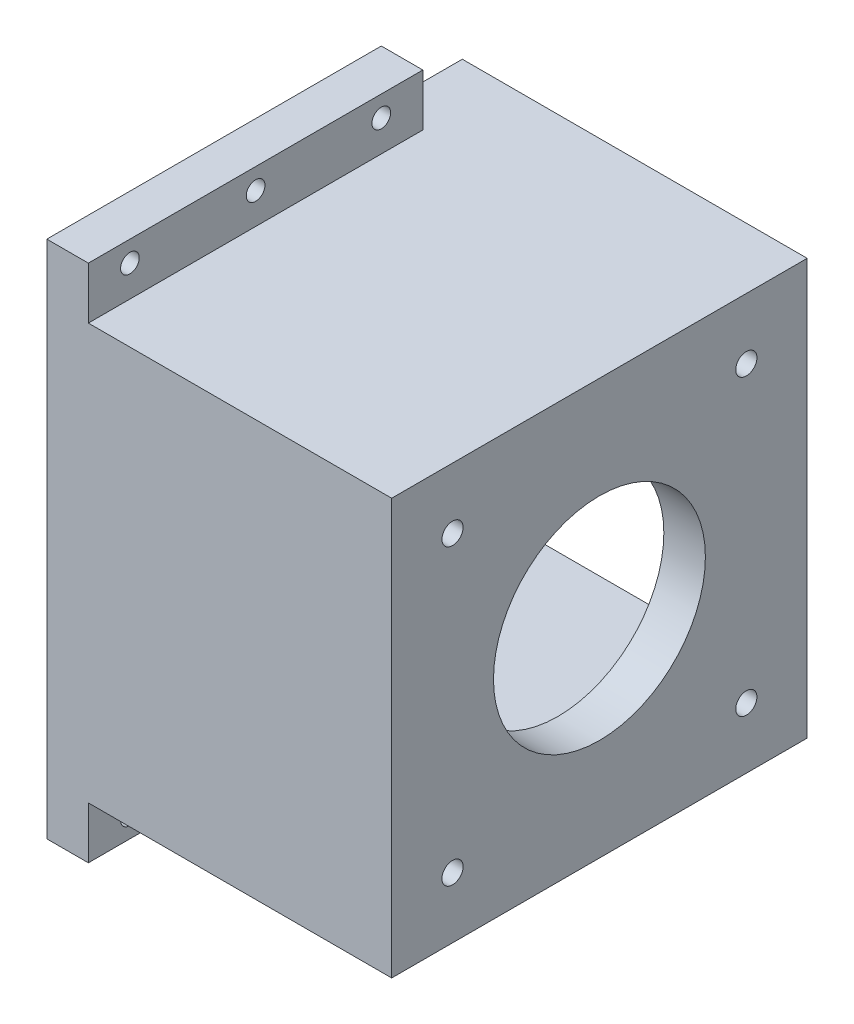
ISO-10303-21;
HEADER;
FILE_DESCRIPTION(('STEP AP214'),'2;1');
FILE_NAME('part.step','',(''),(''),'','','');
FILE_SCHEMA(('AUTOMOTIVE_DESIGN { 1 0 10303 214 1 1 1 1 }'));
ENDSEC;
DATA;
#1=APPLICATION_CONTEXT('core data for automotive mechanical design processes');
#2=APPLICATION_PROTOCOL_DEFINITION('international standard','automotive_design',2000,#1);
#3=PRODUCT_CONTEXT('',#1,'mechanical');
#4=PRODUCT('Part','Part','',(#3));
#5=PRODUCT_RELATED_PRODUCT_CATEGORY('part','',(#4));
#6=PRODUCT_DEFINITION_FORMATION('','',#4);
#7=PRODUCT_DEFINITION_CONTEXT('part definition',#1,'design');
#8=PRODUCT_DEFINITION('design','',#6,#7);
#9=PRODUCT_DEFINITION_SHAPE('','',#8);
#10=(LENGTH_UNIT() NAMED_UNIT(*) SI_UNIT(.MILLI.,.METRE.));
#11=(NAMED_UNIT(*) PLANE_ANGLE_UNIT() SI_UNIT($,.RADIAN.));
#12=(NAMED_UNIT(*) SI_UNIT($,.STERADIAN.) SOLID_ANGLE_UNIT());
#13=UNCERTAINTY_MEASURE_WITH_UNIT(LENGTH_MEASURE(1.E-05),#10,'distance_accuracy_value','');
#14=(GEOMETRIC_REPRESENTATION_CONTEXT(3) GLOBAL_UNCERTAINTY_ASSIGNED_CONTEXT((#13)) GLOBAL_UNIT_ASSIGNED_CONTEXT((#10,
#11,#12)) REPRESENTATION_CONTEXT('',''));
#15=CARTESIAN_POINT('',(0.,0.,0.));
#16=DIRECTION('',(0.,0.,1.));
#17=DIRECTION('',(1.,0.,0.));
#18=AXIS2_PLACEMENT_3D('',#15,#16,#17);
#19=CARTESIAN_POINT('',(0.,0.,-200.));
#20=DIRECTION('',(-1.,0.,0.));
#21=DIRECTION('',(0.,0.,1.));
#22=AXIS2_PLACEMENT_3D('',#19,#20,#21);
#23=PLANE('',#22);
#24=CARTESIAN_POINT('',(0.,9.9999999999989,-20.));
#25=DIRECTION('',(-1.,0.,0.));
#26=DIRECTION('',(0.,0.,1.));
#27=AXIS2_PLACEMENT_3D('',#24,#25,#26);
#28=CIRCLE('',#27,4.5);
#29=CARTESIAN_POINT('',(0.,9.9999999999989,-15.5));
#30=VERTEX_POINT('',#29);
#31=EDGE_CURVE('E319',#30,#30,#28,.F.);
#32=ORIENTED_EDGE('',*,*,#31,.T.);
#33=EDGE_LOOP('',(#32));
#34=FACE_BOUND('',#33,.T.);
#35=CARTESIAN_POINT('',(0.,9.99999999999807,-80.5));
#36=DIRECTION('',(-1.,0.,0.));
#37=DIRECTION('',(0.,0.,1.));
#38=AXIS2_PLACEMENT_3D('',#35,#36,#37);
#39=CIRCLE('',#38,4.50000000000001);
#40=CARTESIAN_POINT('',(0.,9.99999999999807,-76.));
#41=VERTEX_POINT('',#40);
#42=EDGE_CURVE('E323',#41,#41,#39,.F.);
#43=ORIENTED_EDGE('',*,*,#42,.T.);
#44=EDGE_LOOP('',(#43));
#45=FACE_BOUND('',#44,.T.);
#46=CARTESIAN_POINT('',(0.,9.99999999999721,-141.));
#47=DIRECTION('',(-1.,0.,0.));
#48=DIRECTION('',(0.,0.,1.));
#49=AXIS2_PLACEMENT_3D('',#46,#47,#48);
#50=CIRCLE('',#49,4.50000000000002);
#51=CARTESIAN_POINT('',(0.,9.99999999999721,-136.5));
#52=VERTEX_POINT('',#51);
#53=EDGE_CURVE('E327',#52,#52,#50,.F.);
#54=ORIENTED_EDGE('',*,*,#53,.T.);
#55=EDGE_LOOP('',(#54));
#56=FACE_BOUND('',#55,.T.);
#57=CARTESIAN_POINT('',(0.,240.000000000002,-141.));
#58=DIRECTION('',(-1.,0.,0.));
#59=DIRECTION('',(0.,0.,1.));
#60=AXIS2_PLACEMENT_3D('',#57,#58,#59);
#61=CIRCLE('',#60,4.50000000000002);
#62=CARTESIAN_POINT('',(0.,240.000000000002,-136.5));
#63=VERTEX_POINT('',#62);
#64=EDGE_CURVE('E331',#63,#63,#61,.F.);
#65=ORIENTED_EDGE('',*,*,#64,.T.);
#66=EDGE_LOOP('',(#65));
#67=FACE_BOUND('',#66,.T.);
#68=CARTESIAN_POINT('',(0.,240.000000000001,-80.5));
#69=DIRECTION('',(-1.,0.,0.));
#70=DIRECTION('',(0.,0.,1.));
#71=AXIS2_PLACEMENT_3D('',#68,#69,#70);
#72=CIRCLE('',#71,4.50000000000001);
#73=CARTESIAN_POINT('',(0.,240.000000000001,-76.));
#74=VERTEX_POINT('',#73);
#75=EDGE_CURVE('E335',#74,#74,#72,.F.);
#76=ORIENTED_EDGE('',*,*,#75,.T.);
#77=EDGE_LOOP('',(#76));
#78=FACE_BOUND('',#77,.T.);
#79=CARTESIAN_POINT('',(0.,240.,-20.));
#80=DIRECTION('',(-1.,0.,0.));
#81=DIRECTION('',(0.,0.,1.));
#82=AXIS2_PLACEMENT_3D('',#79,#80,#81);
#83=CIRCLE('',#82,4.5);
#84=CARTESIAN_POINT('',(0.,240.,-15.5));
#85=VERTEX_POINT('',#84);
#86=EDGE_CURVE('E339',#85,#85,#83,.F.);
#87=ORIENTED_EDGE('',*,*,#86,.T.);
#88=EDGE_LOOP('',(#87));
#89=FACE_BOUND('',#88,.T.);
#90=CARTESIAN_POINT('',(0.,125.,-100.));
#91=DIRECTION('',(-1.,0.,0.));
#92=DIRECTION('',(0.,0.,1.));
#93=AXIS2_PLACEMENT_3D('',#90,#91,#92);
#94=CIRCLE('',#93,57.15);
#95=CARTESIAN_POINT('',(0.,125.,-42.85));
#96=VERTEX_POINT('',#95);
#97=EDGE_CURVE('E342',#96,#96,#94,.T.);
#98=ORIENTED_EDGE('',*,*,#97,.F.);
#99=EDGE_LOOP('',(#98));
#100=FACE_BOUND('',#99,.T.);
#101=DIRECTION('',(0.,1.,0.));
#102=VECTOR('',#101,1.);
#103=CARTESIAN_POINT('',(0.,250.,-161.));
#104=LINE('',#103,#102);
#105=CARTESIAN_POINT('',(0.,225.,-161.));
#106=VERTEX_POINT('',#105);
#107=CARTESIAN_POINT('',(0.,250.,-161.));
#108=VERTEX_POINT('',#107);
#109=EDGE_CURVE('E192',#106,#108,#104,.T.);
#110=ORIENTED_EDGE('',*,*,#109,.F.);
#111=DIRECTION('',(0.,0.,1.));
#112=VECTOR('',#111,1.);
#113=CARTESIAN_POINT('',(0.,225.,-200.));
#114=LINE('',#113,#112);
#115=CARTESIAN_POINT('',(0.,225.,-200.));
#116=VERTEX_POINT('',#115);
#117=EDGE_CURVE('E193',#116,#106,#114,.T.);
#118=ORIENTED_EDGE('',*,*,#117,.F.);
#119=DIRECTION('',(0.,-1.,0.));
#120=VECTOR('',#119,1.);
#121=CARTESIAN_POINT('',(0.,0.,-200.));
#122=LINE('',#121,#120);
#123=CARTESIAN_POINT('',(0.,25.,-200.));
#124=VERTEX_POINT('',#123);
#125=EDGE_CURVE('E213',#116,#124,#122,.T.);
#126=ORIENTED_EDGE('',*,*,#125,.T.);
#127=DIRECTION('',(0.,0.,-1.));
#128=VECTOR('',#127,1.);
#129=CARTESIAN_POINT('',(0.,25.,-200.));
#130=LINE('',#129,#128);
#131=CARTESIAN_POINT('',(0.,25.,-161.));
#132=VERTEX_POINT('',#131);
#133=EDGE_CURVE('E207',#132,#124,#130,.T.);
#134=ORIENTED_EDGE('',*,*,#133,.F.);
#135=DIRECTION('',(0.,1.,0.));
#136=VECTOR('',#135,1.);
#137=CARTESIAN_POINT('',(0.,25.,-161.));
#138=LINE('',#137,#136);
#139=CARTESIAN_POINT('',(0.,0.,-161.));
#140=VERTEX_POINT('',#139);
#141=EDGE_CURVE('E196',#140,#132,#138,.T.);
#142=ORIENTED_EDGE('',*,*,#141,.F.);
#143=DIRECTION('',(0.,0.,1.));
#144=VECTOR('',#143,1.);
#145=CARTESIAN_POINT('',(0.,0.,-200.));
#146=LINE('',#145,#144);
#147=CARTESIAN_POINT('',(0.,0.,0.));
#148=VERTEX_POINT('',#147);
#149=EDGE_CURVE('E223',#140,#148,#146,.T.);
#150=ORIENTED_EDGE('',*,*,#149,.T.);
#151=DIRECTION('',(0.,-1.,0.));
#152=VECTOR('',#151,1.);
#153=CARTESIAN_POINT('',(0.,0.,0.));
#154=LINE('',#153,#152);
#155=CARTESIAN_POINT('',(0.,250.,0.));
#156=VERTEX_POINT('',#155);
#157=EDGE_CURVE('E201',#156,#148,#154,.T.);
#158=ORIENTED_EDGE('',*,*,#157,.F.);
#159=DIRECTION('',(0.,0.,1.));
#160=VECTOR('',#159,1.);
#161=CARTESIAN_POINT('',(0.,250.,-200.));
#162=LINE('',#161,#160);
#163=EDGE_CURVE('E11',#108,#156,#162,.T.);
#164=ORIENTED_EDGE('',*,*,#163,.F.);
#165=EDGE_LOOP('',(#110,#118,#126,#134,#142,#150,#158,#164));
#166=FACE_BOUND('',#165,.T.);
#167=ADVANCED_FACE('F43',(#34,#45,#56,#67,#78,#89,#100,#166),#23,.T.);
#168=CARTESIAN_POINT('',(0.,250.,-200.));
#169=DIRECTION('',(0.,1.,0.));
#170=DIRECTION('',(0.,0.,1.));
#171=AXIS2_PLACEMENT_3D('',#168,#169,#170);
#172=PLANE('',#171);
#173=DIRECTION('',(-1.,0.,0.));
#174=VECTOR('',#173,1.);
#175=CARTESIAN_POINT('',(20.,250.,-161.));
#176=LINE('',#175,#174);
#177=CARTESIAN_POINT('',(20.,250.,-161.));
#178=VERTEX_POINT('',#177);
#179=EDGE_CURVE('E198',#178,#108,#176,.T.);
#180=ORIENTED_EDGE('',*,*,#179,.T.);
#181=ORIENTED_EDGE('',*,*,#163,.T.);
#182=DIRECTION('',(-1.,0.,0.));
#183=VECTOR('',#182,1.);
#184=CARTESIAN_POINT('',(0.,250.,0.));
#185=LINE('',#184,#183);
#186=CARTESIAN_POINT('',(20.,250.,0.));
#187=VERTEX_POINT('',#186);
#188=EDGE_CURVE('E216',#187,#156,#185,.T.);
#189=ORIENTED_EDGE('',*,*,#188,.F.);
#190=DIRECTION('',(0.,0.,1.));
#191=VECTOR('',#190,1.);
#192=CARTESIAN_POINT('',(20.,250.,-200.));
#193=LINE('',#192,#191);
#194=EDGE_CURVE('E51',#178,#187,#193,.T.);
#195=ORIENTED_EDGE('',*,*,#194,.F.);
#196=EDGE_LOOP('',(#180,#181,#189,#195));
#197=FACE_BOUND('',#196,.T.);
#198=ADVANCED_FACE('F275',(#197),#172,.T.);
#199=CARTESIAN_POINT('',(20.0000000000001,225.,-200.));
#200=DIRECTION('',(1.,0.,0.));
#201=DIRECTION('',(0.,1.,0.));
#202=AXIS2_PLACEMENT_3D('',#199,#200,#201);
#203=PLANE('',#202);
#204=CARTESIAN_POINT('',(20.,240.000000000002,-141.));
#205=DIRECTION('',(1.,0.,0.));
#206=DIRECTION('',(0.,1.,0.));
#207=AXIS2_PLACEMENT_3D('',#204,#205,#206);
#208=CIRCLE('',#207,4.50000000000002);
#209=CARTESIAN_POINT('',(20.,244.500000000002,-141.));
#210=VERTEX_POINT('',#209);
#211=EDGE_CURVE('E633',#210,#210,#208,.T.);
#212=ORIENTED_EDGE('',*,*,#211,.F.);
#213=EDGE_LOOP('',(#212));
#214=FACE_BOUND('',#213,.T.);
#215=CARTESIAN_POINT('',(20.,240.000000000001,-80.5));
#216=DIRECTION('',(1.,0.,0.));
#217=DIRECTION('',(0.,1.,0.));
#218=AXIS2_PLACEMENT_3D('',#215,#216,#217);
#219=CIRCLE('',#218,4.50000000000001);
#220=CARTESIAN_POINT('',(20.,244.500000000001,-80.5));
#221=VERTEX_POINT('',#220);
#222=EDGE_CURVE('E629',#221,#221,#219,.T.);
#223=ORIENTED_EDGE('',*,*,#222,.F.);
#224=EDGE_LOOP('',(#223));
#225=FACE_BOUND('',#224,.T.);
#226=CARTESIAN_POINT('',(20.,240.,-20.));
#227=DIRECTION('',(1.,0.,0.));
#228=DIRECTION('',(0.,1.,0.));
#229=AXIS2_PLACEMENT_3D('',#226,#227,#228);
#230=CIRCLE('',#229,4.5);
#231=CARTESIAN_POINT('',(20.,244.5,-20.));
#232=VERTEX_POINT('',#231);
#233=EDGE_CURVE('E345',#232,#232,#230,.T.);
#234=ORIENTED_EDGE('',*,*,#233,.F.);
#235=EDGE_LOOP('',(#234));
#236=FACE_BOUND('',#235,.T.);
#237=DIRECTION('',(0.,1.,0.));
#238=VECTOR('',#237,1.);
#239=CARTESIAN_POINT('',(20.,250.,-161.));
#240=LINE('',#239,#238);
#241=CARTESIAN_POINT('',(20.,225.,-161.));
#242=VERTEX_POINT('',#241);
#243=EDGE_CURVE('E188',#242,#178,#240,.T.);
#244=ORIENTED_EDGE('',*,*,#243,.T.);
#245=ORIENTED_EDGE('',*,*,#194,.T.);
#246=DIRECTION('',(0.,1.,0.));
#247=VECTOR('',#246,1.);
#248=CARTESIAN_POINT('',(20.0000000000001,225.,0.));
#249=LINE('',#248,#247);
#250=CARTESIAN_POINT('',(20.0000000000001,225.,0.));
#251=VERTEX_POINT('',#250);
#252=EDGE_CURVE('E241',#251,#187,#249,.T.);
#253=ORIENTED_EDGE('',*,*,#252,.F.);
#254=DIRECTION('',(0.,0.,1.));
#255=VECTOR('',#254,1.);
#256=CARTESIAN_POINT('',(20.0000000000001,225.,-200.));
#257=LINE('',#256,#255);
#258=EDGE_CURVE('E247',#242,#251,#257,.T.);
#259=ORIENTED_EDGE('',*,*,#258,.F.);
#260=EDGE_LOOP('',(#244,#245,#253,#259));
#261=FACE_BOUND('',#260,.T.);
#262=ADVANCED_FACE('F298',(#214,#225,#236,#261),#203,.T.);
#263=CARTESIAN_POINT('',(20.0000000000001,225.,-200.));
#264=DIRECTION('',(0.,1.,0.));
#265=DIRECTION('',(0.,0.,1.));
#266=AXIS2_PLACEMENT_3D('',#263,#264,#265);
#267=PLANE('',#266);
#268=DIRECTION('',(-1.,0.,0.));
#269=VECTOR('',#268,1.);
#270=CARTESIAN_POINT('',(20.0000000000001,225.,0.));
#271=LINE('',#270,#269);
#272=CARTESIAN_POINT('',(166.,225.,0.));
#273=VERTEX_POINT('',#272);
#274=EDGE_CURVE('E238',#273,#251,#271,.T.);
#275=ORIENTED_EDGE('',*,*,#274,.F.);
#276=DIRECTION('',(0.,0.,1.));
#277=VECTOR('',#276,1.);
#278=CARTESIAN_POINT('',(166.,225.,-200.));
#279=LINE('',#278,#277);
#280=CARTESIAN_POINT('',(166.,225.,-200.));
#281=VERTEX_POINT('',#280);
#282=EDGE_CURVE('E249',#281,#273,#279,.T.);
#283=ORIENTED_EDGE('',*,*,#282,.F.);
#284=DIRECTION('',(-1.,0.,0.));
#285=VECTOR('',#284,1.);
#286=CARTESIAN_POINT('',(20.0000000000001,225.,-200.));
#287=LINE('',#286,#285);
#288=EDGE_CURVE('E221',#281,#116,#287,.T.);
#289=ORIENTED_EDGE('',*,*,#288,.T.);
#290=ORIENTED_EDGE('',*,*,#117,.T.);
#291=DIRECTION('',(-1.,0.,0.));
#292=VECTOR('',#291,1.);
#293=CARTESIAN_POINT('',(20.,225.,-161.));
#294=LINE('',#293,#292);
#295=EDGE_CURVE('E191',#242,#106,#294,.T.);
#296=ORIENTED_EDGE('',*,*,#295,.F.);
#297=ORIENTED_EDGE('',*,*,#258,.T.);
#298=EDGE_LOOP('',(#275,#283,#289,#290,#296,#297));
#299=FACE_BOUND('',#298,.T.);
#300=ADVANCED_FACE('F283',(#299),#267,.T.);
#301=CARTESIAN_POINT('',(166.,25.,-200.));
#302=DIRECTION('',(1.,0.,0.));
#303=DIRECTION('',(0.,0.,-1.));
#304=AXIS2_PLACEMENT_3D('',#301,#302,#303);
#305=PLANE('',#304);
#306=CARTESIAN_POINT('',(166.,54.2900000000008,-170.711356230807));
#307=DIRECTION('',(1.,0.,0.));
#308=DIRECTION('',(0.,0.,-1.));
#309=AXIS2_PLACEMENT_3D('',#306,#307,#308);
#310=CIRCLE('',#309,5.09999999999999);
#311=CARTESIAN_POINT('',(166.,54.2900000000008,-175.811356230807));
#312=VERTEX_POINT('',#311);
#313=EDGE_CURVE('E605',#312,#312,#310,.T.);
#314=ORIENTED_EDGE('',*,*,#313,.F.);
#315=EDGE_LOOP('',(#314));
#316=FACE_BOUND('',#315,.T.);
#317=CARTESIAN_POINT('',(166.,54.2886437691936,-29.29));
#318=DIRECTION('',(1.,0.,0.));
#319=DIRECTION('',(0.,0.,-1.));
#320=AXIS2_PLACEMENT_3D('',#317,#318,#319);
#321=CIRCLE('',#320,5.09999999999999);
#322=CARTESIAN_POINT('',(166.,54.2886437691936,-34.39));
#323=VERTEX_POINT('',#322);
#324=EDGE_CURVE('E607',#323,#323,#321,.T.);
#325=ORIENTED_EDGE('',*,*,#324,.F.);
#326=EDGE_LOOP('',(#325));
#327=FACE_BOUND('',#326,.T.);
#328=CARTESIAN_POINT('',(166.,195.71,-29.2886437691933));
#329=DIRECTION('',(1.,0.,0.));
#330=DIRECTION('',(0.,0.,-1.));
#331=AXIS2_PLACEMENT_3D('',#328,#329,#330);
#332=CIRCLE('',#331,5.09999999999999);
#333=CARTESIAN_POINT('',(166.,195.71,-34.3886437691933));
#334=VERTEX_POINT('',#333);
#335=EDGE_CURVE('E615',#334,#334,#332,.T.);
#336=ORIENTED_EDGE('',*,*,#335,.F.);
#337=EDGE_LOOP('',(#336));
#338=FACE_BOUND('',#337,.T.);
#339=CARTESIAN_POINT('',(166.,195.711356230806,-170.71));
#340=DIRECTION('',(1.,0.,0.));
#341=DIRECTION('',(0.,0.,-1.));
#342=AXIS2_PLACEMENT_3D('',#339,#340,#341);
#343=CIRCLE('',#342,5.09999999999999);
#344=CARTESIAN_POINT('',(166.,195.711356230806,-175.81));
#345=VERTEX_POINT('',#344);
#346=EDGE_CURVE('E621',#345,#345,#343,.T.);
#347=ORIENTED_EDGE('',*,*,#346,.F.);
#348=EDGE_LOOP('',(#347));
#349=FACE_BOUND('',#348,.T.);
#350=CARTESIAN_POINT('',(166.,125.,-100.));
#351=DIRECTION('',(1.,0.,0.));
#352=DIRECTION('',(0.,0.,-1.));
#353=AXIS2_PLACEMENT_3D('',#350,#351,#352);
#354=CIRCLE('',#353,51.);
#355=CARTESIAN_POINT('',(166.,125.,-151.));
#356=VERTEX_POINT('',#355);
#357=EDGE_CURVE('E358',#356,#356,#354,.T.);
#358=ORIENTED_EDGE('',*,*,#357,.F.);
#359=EDGE_LOOP('',(#358));
#360=FACE_BOUND('',#359,.T.);
#361=DIRECTION('',(0.,1.,0.));
#362=VECTOR('',#361,1.);
#363=CARTESIAN_POINT('',(166.,25.,0.));
#364=LINE('',#363,#362);
#365=CARTESIAN_POINT('',(166.,25.,0.));
#366=VERTEX_POINT('',#365);
#367=EDGE_CURVE('E235',#366,#273,#364,.T.);
#368=ORIENTED_EDGE('',*,*,#367,.F.);
#369=DIRECTION('',(0.,0.,1.));
#370=VECTOR('',#369,1.);
#371=CARTESIAN_POINT('',(166.,25.,-200.));
#372=LINE('',#371,#370);
#373=CARTESIAN_POINT('',(166.,25.,-200.));
#374=VERTEX_POINT('',#373);
#375=EDGE_CURVE('E251',#374,#366,#372,.T.);
#376=ORIENTED_EDGE('',*,*,#375,.F.);
#377=DIRECTION('',(0.,1.,0.));
#378=VECTOR('',#377,1.);
#379=CARTESIAN_POINT('',(166.,25.,-200.));
#380=LINE('',#379,#378);
#381=EDGE_CURVE('E218',#374,#281,#380,.T.);
#382=ORIENTED_EDGE('',*,*,#381,.T.);
#383=ORIENTED_EDGE('',*,*,#282,.T.);
#384=EDGE_LOOP('',(#368,#376,#382,#383));
#385=FACE_BOUND('',#384,.T.);
#386=ADVANCED_FACE('F288',(#316,#327,#338,#349,#360,#385),#305,.T.);
#387=CARTESIAN_POINT('',(20.0000000000001,25.,-200.));
#388=DIRECTION('',(0.,-1.,0.));
#389=DIRECTION('',(0.,0.,-1.));
#390=AXIS2_PLACEMENT_3D('',#387,#388,#389);
#391=PLANE('',#390);
#392=DIRECTION('',(1.,0.,0.));
#393=VECTOR('',#392,1.);
#394=CARTESIAN_POINT('',(20.0000000000001,25.,0.));
#395=LINE('',#394,#393);
#396=CARTESIAN_POINT('',(20.0000000000001,25.,0.));
#397=VERTEX_POINT('',#396);
#398=EDGE_CURVE('E232',#397,#366,#395,.T.);
#399=ORIENTED_EDGE('',*,*,#398,.F.);
#400=DIRECTION('',(0.,0.,1.));
#401=VECTOR('',#400,1.);
#402=CARTESIAN_POINT('',(20.0000000000001,25.,-200.));
#403=LINE('',#402,#401);
#404=CARTESIAN_POINT('',(20.,25.,-161.));
#405=VERTEX_POINT('',#404);
#406=EDGE_CURVE('E253',#405,#397,#403,.T.);
#407=ORIENTED_EDGE('',*,*,#406,.F.);
#408=DIRECTION('',(-1.,0.,0.));
#409=VECTOR('',#408,1.);
#410=CARTESIAN_POINT('',(20.,25.,-161.));
#411=LINE('',#410,#409);
#412=EDGE_CURVE('E203',#405,#132,#411,.T.);
#413=ORIENTED_EDGE('',*,*,#412,.T.);
#414=ORIENTED_EDGE('',*,*,#133,.T.);
#415=DIRECTION('',(1.,0.,0.));
#416=VECTOR('',#415,1.);
#417=CARTESIAN_POINT('',(20.0000000000001,25.,-200.));
#418=LINE('',#417,#416);
#419=EDGE_CURVE('E67',#124,#374,#418,.T.);
#420=ORIENTED_EDGE('',*,*,#419,.T.);
#421=ORIENTED_EDGE('',*,*,#375,.T.);
#422=EDGE_LOOP('',(#399,#407,#413,#414,#420,#421));
#423=FACE_BOUND('',#422,.T.);
#424=ADVANCED_FACE('F291',(#423),#391,.T.);
#425=CARTESIAN_POINT('',(20.,0.,-200.));
#426=DIRECTION('',(1.,0.,0.));
#427=DIRECTION('',(0.,1.,0.));
#428=AXIS2_PLACEMENT_3D('',#425,#426,#427);
#429=PLANE('',#428);
#430=CARTESIAN_POINT('',(20.0000000000009,9.99999999999897,-20.));
#431=DIRECTION('',(1.,0.,0.));
#432=DIRECTION('',(0.,-1.,0.));
#433=AXIS2_PLACEMENT_3D('',#430,#431,#432);
#434=CIRCLE('',#433,4.5);
#435=CARTESIAN_POINT('',(20.0000000000009,5.49999999999897,-20.));
#436=VERTEX_POINT('',#435);
#437=EDGE_CURVE('E627',#436,#436,#434,.T.);
#438=ORIENTED_EDGE('',*,*,#437,.F.);
#439=EDGE_LOOP('',(#438));
#440=FACE_BOUND('',#439,.T.);
#441=CARTESIAN_POINT('',(20.0000000000009,9.99999999999814,-80.5));
#442=DIRECTION('',(1.,0.,0.));
#443=DIRECTION('',(0.,-1.,0.));
#444=AXIS2_PLACEMENT_3D('',#441,#442,#443);
#445=CIRCLE('',#444,4.50000000000001);
#446=CARTESIAN_POINT('',(20.0000000000009,5.49999999999813,-80.5));
#447=VERTEX_POINT('',#446);
#448=EDGE_CURVE('E641',#447,#447,#445,.T.);
#449=ORIENTED_EDGE('',*,*,#448,.F.);
#450=EDGE_LOOP('',(#449));
#451=FACE_BOUND('',#450,.T.);
#452=CARTESIAN_POINT('',(20.0000000000009,9.99999999999728,-141.));
#453=DIRECTION('',(1.,0.,0.));
#454=DIRECTION('',(0.,-1.,0.));
#455=AXIS2_PLACEMENT_3D('',#452,#453,#454);
#456=CIRCLE('',#455,4.50000000000002);
#457=CARTESIAN_POINT('',(20.0000000000009,5.49999999999726,-141.));
#458=VERTEX_POINT('',#457);
#459=EDGE_CURVE('E637',#458,#458,#456,.T.);
#460=ORIENTED_EDGE('',*,*,#459,.F.);
#461=EDGE_LOOP('',(#460));
#462=FACE_BOUND('',#461,.T.);
#463=DIRECTION('',(0.,1.,0.));
#464=VECTOR('',#463,1.);
#465=CARTESIAN_POINT('',(20.,25.,-161.));
#466=LINE('',#465,#464);
#467=CARTESIAN_POINT('',(20.,0.,-161.));
#468=VERTEX_POINT('',#467);
#469=EDGE_CURVE('E205',#468,#405,#466,.T.);
#470=ORIENTED_EDGE('',*,*,#469,.T.);
#471=ORIENTED_EDGE('',*,*,#406,.T.);
#472=DIRECTION('',(0.,1.,0.));
#473=VECTOR('',#472,1.);
#474=CARTESIAN_POINT('',(20.,0.,0.));
#475=LINE('',#474,#473);
#476=CARTESIAN_POINT('',(20.,0.,0.));
#477=VERTEX_POINT('',#476);
#478=EDGE_CURVE('E229',#477,#397,#475,.T.);
#479=ORIENTED_EDGE('',*,*,#478,.F.);
#480=DIRECTION('',(0.,0.,1.));
#481=VECTOR('',#480,1.);
#482=CARTESIAN_POINT('',(20.,0.,-200.));
#483=LINE('',#482,#481);
#484=EDGE_CURVE('E255',#468,#477,#483,.T.);
#485=ORIENTED_EDGE('',*,*,#484,.F.);
#486=EDGE_LOOP('',(#470,#471,#479,#485));
#487=FACE_BOUND('',#486,.T.);
#488=ADVANCED_FACE('F296',(#440,#451,#462,#487),#429,.T.);
#489=CARTESIAN_POINT('',(0.,0.,-200.));
#490=DIRECTION('',(0.,-1.,0.));
#491=DIRECTION('',(0.,0.,-1.));
#492=AXIS2_PLACEMENT_3D('',#489,#490,#491);
#493=PLANE('',#492);
#494=DIRECTION('',(-1.,0.,0.));
#495=VECTOR('',#494,1.);
#496=CARTESIAN_POINT('',(20.,0.,-161.));
#497=LINE('',#496,#495);
#498=EDGE_CURVE('E184',#468,#140,#497,.T.);
#499=ORIENTED_EDGE('',*,*,#498,.F.);
#500=ORIENTED_EDGE('',*,*,#484,.T.);
#501=DIRECTION('',(1.,0.,0.));
#502=VECTOR('',#501,1.);
#503=CARTESIAN_POINT('',(0.,0.,0.));
#504=LINE('',#503,#502);
#505=EDGE_CURVE('E226',#148,#477,#504,.T.);
#506=ORIENTED_EDGE('',*,*,#505,.F.);
#507=ORIENTED_EDGE('',*,*,#149,.F.);
#508=EDGE_LOOP('',(#499,#500,#506,#507));
#509=FACE_BOUND('',#508,.T.);
#510=ADVANCED_FACE('F266',(#509),#493,.T.);
#511=CARTESIAN_POINT('',(0.,0.,-200.));
#512=DIRECTION('',(0.,0.,-1.));
#513=DIRECTION('',(-1.,0.,0.));
#514=AXIS2_PLACEMENT_3D('',#511,#512,#513);
#515=PLANE('',#514);
#516=DIRECTION('',(0.,-1.,0.));
#517=VECTOR('',#516,1.);
#518=CARTESIAN_POINT('',(146.,202.583335176865,-200.));
#519=LINE('',#518,#517);
#520=CARTESIAN_POINT('',(146.,202.583335176865,-200.));
#521=VERTEX_POINT('',#520);
#522=CARTESIAN_POINT('',(146.,42.5833351768647,-200.));
#523=VERTEX_POINT('',#522);
#524=EDGE_CURVE('E59',#521,#523,#519,.T.);
#525=ORIENTED_EDGE('',*,*,#524,.F.);
#526=DIRECTION('',(1.,0.,0.));
#527=VECTOR('',#526,1.);
#528=CARTESIAN_POINT('',(146.,202.583335176865,-200.));
#529=LINE('',#528,#527);
#530=CARTESIAN_POINT('',(20.,202.583335176865,-200.));
#531=VERTEX_POINT('',#530);
#532=EDGE_CURVE('E166',#531,#521,#529,.T.);
#533=ORIENTED_EDGE('',*,*,#532,.F.);
#534=DIRECTION('',(0.,1.,0.));
#535=VECTOR('',#534,1.);
#536=CARTESIAN_POINT('',(20.,202.583335176865,-200.));
#537=LINE('',#536,#535);
#538=CARTESIAN_POINT('',(19.9999999999999,42.5833351768647,-200.));
#539=VERTEX_POINT('',#538);
#540=EDGE_CURVE('E169',#539,#531,#537,.T.);
#541=ORIENTED_EDGE('',*,*,#540,.F.);
#542=DIRECTION('',(-1.,0.,0.));
#543=VECTOR('',#542,1.);
#544=CARTESIAN_POINT('',(146.,42.5833351768647,-200.));
#545=LINE('',#544,#543);
#546=EDGE_CURVE('E178',#523,#539,#545,.T.);
#547=ORIENTED_EDGE('',*,*,#546,.F.);
#548=EDGE_LOOP('',(#525,#533,#541,#547));
#549=FACE_BOUND('',#548,.T.);
#550=ORIENTED_EDGE('',*,*,#125,.F.);
#551=ORIENTED_EDGE('',*,*,#288,.F.);
#552=ORIENTED_EDGE('',*,*,#381,.F.);
#553=ORIENTED_EDGE('',*,*,#419,.F.);
#554=EDGE_LOOP('',(#550,#551,#552,#553));
#555=FACE_BOUND('',#554,.T.);
#556=ADVANCED_FACE('F285',(#549,#555),#515,.T.);
#557=CARTESIAN_POINT('',(0.,0.,0.));
#558=DIRECTION('',(0.,0.,-1.));
#559=DIRECTION('',(-1.,0.,0.));
#560=AXIS2_PLACEMENT_3D('',#557,#558,#559);
#561=PLANE('',#560);
#562=ORIENTED_EDGE('',*,*,#157,.T.);
#563=ORIENTED_EDGE('',*,*,#505,.T.);
#564=ORIENTED_EDGE('',*,*,#478,.T.);
#565=ORIENTED_EDGE('',*,*,#398,.T.);
#566=ORIENTED_EDGE('',*,*,#367,.T.);
#567=ORIENTED_EDGE('',*,*,#274,.T.);
#568=ORIENTED_EDGE('',*,*,#252,.T.);
#569=ORIENTED_EDGE('',*,*,#188,.T.);
#570=EDGE_LOOP('',(#562,#563,#564,#565,#566,#567,#568,#569));
#571=FACE_BOUND('',#570,.T.);
#572=ADVANCED_FACE('F270',(#571),#561,.F.);
#573=CARTESIAN_POINT('',(20.,25.,-161.));
#574=DIRECTION('',(0.,0.,1.));
#575=DIRECTION('',(0.,-1.,0.));
#576=AXIS2_PLACEMENT_3D('',#573,#574,#575);
#577=PLANE('',#576);
#578=ORIENTED_EDGE('',*,*,#141,.T.);
#579=ORIENTED_EDGE('',*,*,#412,.F.);
#580=ORIENTED_EDGE('',*,*,#469,.F.);
#581=ORIENTED_EDGE('',*,*,#498,.T.);
#582=EDGE_LOOP('',(#578,#579,#580,#581));
#583=FACE_BOUND('',#582,.T.);
#584=ADVANCED_FACE('F294',(#583),#577,.F.);
#585=CARTESIAN_POINT('',(20.,250.,-161.));
#586=DIRECTION('',(0.,0.,1.));
#587=DIRECTION('',(0.,-1.,0.));
#588=AXIS2_PLACEMENT_3D('',#585,#586,#587);
#589=PLANE('',#588);
#590=ORIENTED_EDGE('',*,*,#109,.T.);
#591=ORIENTED_EDGE('',*,*,#179,.F.);
#592=ORIENTED_EDGE('',*,*,#243,.F.);
#593=ORIENTED_EDGE('',*,*,#295,.T.);
#594=EDGE_LOOP('',(#590,#591,#592,#593));
#595=FACE_BOUND('',#594,.T.);
#596=ADVANCED_FACE('F278',(#595),#589,.F.);
#597=CARTESIAN_POINT('',(146.,202.583335176865,-20.));
#598=DIRECTION('',(1.,0.,0.));
#599=DIRECTION('',(0.,1.,0.));
#600=AXIS2_PLACEMENT_3D('',#597,#598,#599);
#601=PLANE('',#600);
#602=CARTESIAN_POINT('',(146.,54.2900000000008,-170.711356230807));
#603=DIRECTION('',(1.,0.,0.));
#604=DIRECTION('',(0.,1.,0.));
#605=AXIS2_PLACEMENT_3D('',#602,#603,#604);
#606=CIRCLE('',#605,5.09999999999999);
#607=CARTESIAN_POINT('',(146.,59.3900000000008,-170.711356230807));
#608=VERTEX_POINT('',#607);
#609=EDGE_CURVE('E46',#608,#608,#606,.T.);
#610=ORIENTED_EDGE('',*,*,#609,.T.);
#611=EDGE_LOOP('',(#610));
#612=FACE_BOUND('',#611,.T.);
#613=CARTESIAN_POINT('',(146.,54.2886437691936,-29.29));
#614=DIRECTION('',(1.,0.,0.));
#615=DIRECTION('',(0.,1.,0.));
#616=AXIS2_PLACEMENT_3D('',#613,#614,#615);
#617=CIRCLE('',#616,5.09999999999999);
#618=CARTESIAN_POINT('',(146.,59.3886437691936,-29.29));
#619=VERTEX_POINT('',#618);
#620=EDGE_CURVE('E609',#619,#619,#617,.T.);
#621=ORIENTED_EDGE('',*,*,#620,.T.);
#622=EDGE_LOOP('',(#621));
#623=FACE_BOUND('',#622,.T.);
#624=CARTESIAN_POINT('',(146.,195.71,-29.2886437691933));
#625=DIRECTION('',(1.,0.,0.));
#626=DIRECTION('',(0.,1.,0.));
#627=AXIS2_PLACEMENT_3D('',#624,#625,#626);
#628=CIRCLE('',#627,5.09999999999999);
#629=CARTESIAN_POINT('',(146.,200.81,-29.2886437691933));
#630=VERTEX_POINT('',#629);
#631=EDGE_CURVE('E618',#630,#630,#628,.T.);
#632=ORIENTED_EDGE('',*,*,#631,.T.);
#633=EDGE_LOOP('',(#632));
#634=FACE_BOUND('',#633,.T.);
#635=CARTESIAN_POINT('',(146.,195.711356230806,-170.71));
#636=DIRECTION('',(1.,0.,0.));
#637=DIRECTION('',(0.,1.,0.));
#638=AXIS2_PLACEMENT_3D('',#635,#636,#637);
#639=CIRCLE('',#638,5.09999999999999);
#640=CARTESIAN_POINT('',(146.,200.811356230806,-170.71));
#641=VERTEX_POINT('',#640);
#642=EDGE_CURVE('E624',#641,#641,#639,.T.);
#643=ORIENTED_EDGE('',*,*,#642,.T.);
#644=EDGE_LOOP('',(#643));
#645=FACE_BOUND('',#644,.T.);
#646=CARTESIAN_POINT('',(146.,125.,-100.));
#647=DIRECTION('',(1.,0.,0.));
#648=DIRECTION('',(0.,1.,0.));
#649=AXIS2_PLACEMENT_3D('',#646,#647,#648);
#650=CIRCLE('',#649,51.);
#651=CARTESIAN_POINT('',(146.,176.,-100.));
#652=VERTEX_POINT('',#651);
#653=EDGE_CURVE('E172',#652,#652,#650,.F.);
#654=ORIENTED_EDGE('',*,*,#653,.F.);
#655=EDGE_LOOP('',(#654));
#656=FACE_BOUND('',#655,.T.);
#657=ORIENTED_EDGE('',*,*,#524,.T.);
#658=DIRECTION('',(0.,0.,-1.));
#659=VECTOR('',#658,1.);
#660=CARTESIAN_POINT('',(146.,42.5833351768647,-20.));
#661=LINE('',#660,#659);
#662=CARTESIAN_POINT('',(146.,42.5833351768647,-20.));
#663=VERTEX_POINT('',#662);
#664=EDGE_CURVE('E144',#663,#523,#661,.T.);
#665=ORIENTED_EDGE('',*,*,#664,.F.);
#666=DIRECTION('',(0.,-1.,0.));
#667=VECTOR('',#666,1.);
#668=CARTESIAN_POINT('',(146.,202.583335176865,-20.));
#669=LINE('',#668,#667);
#670=CARTESIAN_POINT('',(146.,202.583335176865,-20.));
#671=VERTEX_POINT('',#670);
#672=EDGE_CURVE('E148',#671,#663,#669,.T.);
#673=ORIENTED_EDGE('',*,*,#672,.F.);
#674=DIRECTION('',(0.,0.,-1.));
#675=VECTOR('',#674,1.);
#676=CARTESIAN_POINT('',(146.,202.583335176865,-20.));
#677=LINE('',#676,#675);
#678=EDGE_CURVE('E182',#671,#521,#677,.T.);
#679=ORIENTED_EDGE('',*,*,#678,.T.);
#680=EDGE_LOOP('',(#657,#665,#673,#679));
#681=FACE_BOUND('',#680,.T.);
#682=ADVANCED_FACE('F146',(#612,#623,#634,#645,#656,#681),#601,.F.);
#683=CARTESIAN_POINT('',(146.,202.583335176865,-20.));
#684=DIRECTION('',(0.,1.,0.));
#685=DIRECTION('',(0.,0.,1.));
#686=AXIS2_PLACEMENT_3D('',#683,#684,#685);
#687=PLANE('',#686);
#688=ORIENTED_EDGE('',*,*,#532,.T.);
#689=ORIENTED_EDGE('',*,*,#678,.F.);
#690=DIRECTION('',(1.,0.,0.));
#691=VECTOR('',#690,1.);
#692=CARTESIAN_POINT('',(146.,202.583335176865,-20.));
#693=LINE('',#692,#691);
#694=CARTESIAN_POINT('',(20.,202.583335176865,-20.));
#695=VERTEX_POINT('',#694);
#696=EDGE_CURVE('E154',#695,#671,#693,.T.);
#697=ORIENTED_EDGE('',*,*,#696,.F.);
#698=DIRECTION('',(0.,0.,-1.));
#699=VECTOR('',#698,1.);
#700=CARTESIAN_POINT('',(20.,202.583335176865,-20.));
#701=LINE('',#700,#699);
#702=EDGE_CURVE('E185',#695,#531,#701,.T.);
#703=ORIENTED_EDGE('',*,*,#702,.T.);
#704=EDGE_LOOP('',(#688,#689,#697,#703));
#705=FACE_BOUND('',#704,.T.);
#706=ADVANCED_FACE('F368',(#705),#687,.F.);
#707=CARTESIAN_POINT('',(20.,202.583335176865,-20.));
#708=DIRECTION('',(-1.,0.,0.));
#709=DIRECTION('',(0.,-1.,0.));
#710=AXIS2_PLACEMENT_3D('',#707,#708,#709);
#711=PLANE('',#710);
#712=CARTESIAN_POINT('',(19.9999999999999,125.,-100.));
#713=DIRECTION('',(1.,0.,0.));
#714=DIRECTION('',(0.,1.,0.));
#715=AXIS2_PLACEMENT_3D('',#712,#713,#714);
#716=CIRCLE('',#715,25.5);
#717=CARTESIAN_POINT('',(19.9999999999999,150.5,-100.));
#718=VERTEX_POINT('',#717);
#719=EDGE_CURVE('E356',#718,#718,#716,.T.);
#720=ORIENTED_EDGE('',*,*,#719,.F.);
#721=EDGE_LOOP('',(#720));
#722=FACE_BOUND('',#721,.T.);
#723=ORIENTED_EDGE('',*,*,#540,.T.);
#724=ORIENTED_EDGE('',*,*,#702,.F.);
#725=DIRECTION('',(0.,1.,0.));
#726=VECTOR('',#725,1.);
#727=CARTESIAN_POINT('',(20.,202.583335176865,-20.));
#728=LINE('',#727,#726);
#729=CARTESIAN_POINT('',(19.9999999999999,42.5833351768647,-20.));
#730=VERTEX_POINT('',#729);
#731=EDGE_CURVE('E162',#730,#695,#728,.T.);
#732=ORIENTED_EDGE('',*,*,#731,.F.);
#733=DIRECTION('',(0.,0.,-1.));
#734=VECTOR('',#733,1.);
#735=CARTESIAN_POINT('',(19.9999999999999,42.5833351768647,-20.));
#736=LINE('',#735,#734);
#737=EDGE_CURVE('E153',#730,#539,#736,.T.);
#738=ORIENTED_EDGE('',*,*,#737,.T.);
#739=EDGE_LOOP('',(#723,#724,#732,#738));
#740=FACE_BOUND('',#739,.T.);
#741=ADVANCED_FACE('F376',(#722,#740),#711,.F.);
#742=CARTESIAN_POINT('',(146.,42.5833351768647,-20.));
#743=DIRECTION('',(0.,-1.,0.));
#744=DIRECTION('',(1.,0.,0.));
#745=AXIS2_PLACEMENT_3D('',#742,#743,#744);
#746=PLANE('',#745);
#747=ORIENTED_EDGE('',*,*,#546,.T.);
#748=ORIENTED_EDGE('',*,*,#737,.F.);
#749=DIRECTION('',(-1.,0.,0.));
#750=VECTOR('',#749,1.);
#751=CARTESIAN_POINT('',(146.,42.5833351768647,-20.));
#752=LINE('',#751,#750);
#753=EDGE_CURVE('E157',#663,#730,#752,.T.);
#754=ORIENTED_EDGE('',*,*,#753,.F.);
#755=ORIENTED_EDGE('',*,*,#664,.T.);
#756=EDGE_LOOP('',(#747,#748,#754,#755));
#757=FACE_BOUND('',#756,.T.);
#758=ADVANCED_FACE('F158',(#757),#746,.F.);
#759=CARTESIAN_POINT('',(0.,0.,-20.));
#760=DIRECTION('',(0.,0.,-1.));
#761=DIRECTION('',(-1.,0.,0.));
#762=AXIS2_PLACEMENT_3D('',#759,#760,#761);
#763=PLANE('',#762);
#764=ORIENTED_EDGE('',*,*,#672,.T.);
#765=ORIENTED_EDGE('',*,*,#753,.T.);
#766=ORIENTED_EDGE('',*,*,#731,.T.);
#767=ORIENTED_EDGE('',*,*,#696,.T.);
#768=EDGE_LOOP('',(#764,#765,#766,#767));
#769=FACE_BOUND('',#768,.T.);
#770=ADVANCED_FACE('F164',(#769),#763,.T.);
#771=CARTESIAN_POINT('',(-0.001000000000001,125.,-100.));
#772=DIRECTION('',(1.,0.,0.));
#773=DIRECTION('',(0.,0.,-1.));
#774=AXIS2_PLACEMENT_3D('',#771,#772,#773);
#775=CYLINDRICAL_SURFACE('',#774,51.);
#776=ORIENTED_EDGE('',*,*,#357,.T.);
#777=EDGE_LOOP('',(#776));
#778=FACE_BOUND('',#777,.T.);
#779=ORIENTED_EDGE('',*,*,#653,.T.);
#780=EDGE_LOOP('',(#779));
#781=FACE_BOUND('',#780,.T.);
#782=ADVANCED_FACE('F365',(#778,#781),#775,.F.);
#783=CARTESIAN_POINT('',(4.99999999999995,125.,-100.));
#784=DIRECTION('',(1.,0.,0.));
#785=DIRECTION('',(0.,1.,0.));
#786=AXIS2_PLACEMENT_3D('',#783,#784,#785);
#787=CYLINDRICAL_SURFACE('',#786,25.5);
#788=CARTESIAN_POINT('',(4.99999999999995,125.,-100.));
#789=DIRECTION('',(1.,0.,0.));
#790=DIRECTION('',(0.,1.,0.));
#791=AXIS2_PLACEMENT_3D('',#788,#789,#790);
#792=CIRCLE('',#791,25.5);
#793=CARTESIAN_POINT('',(4.99999999999995,150.5,-100.));
#794=VERTEX_POINT('',#793);
#795=EDGE_CURVE('E348',#794,#794,#792,.T.);
#796=ORIENTED_EDGE('',*,*,#795,.F.);
#797=EDGE_LOOP('',(#796));
#798=FACE_BOUND('',#797,.T.);
#799=ORIENTED_EDGE('',*,*,#719,.T.);
#800=EDGE_LOOP('',(#799));
#801=FACE_BOUND('',#800,.T.);
#802=ADVANCED_FACE('F459',(#798,#801),#787,.F.);
#803=CARTESIAN_POINT('',(5.,125.,-100.));
#804=DIRECTION('',(-1.,0.,0.));
#805=DIRECTION('',(0.,0.,1.));
#806=AXIS2_PLACEMENT_3D('',#803,#804,#805);
#807=PLANE('',#806);
#808=CARTESIAN_POINT('',(5.,125.,-100.));
#809=DIRECTION('',(-1.,0.,0.));
#810=DIRECTION('',(0.,0.,1.));
#811=AXIS2_PLACEMENT_3D('',#808,#809,#810);
#812=CIRCLE('',#811,57.15);
#813=CARTESIAN_POINT('',(5.,125.,-42.85));
#814=VERTEX_POINT('',#813);
#815=EDGE_CURVE('E344',#814,#814,#812,.T.);
#816=ORIENTED_EDGE('',*,*,#815,.T.);
#817=EDGE_LOOP('',(#816));
#818=FACE_BOUND('',#817,.T.);
#819=ORIENTED_EDGE('',*,*,#795,.T.);
#820=EDGE_LOOP('',(#819));
#821=FACE_BOUND('',#820,.T.);
#822=ADVANCED_FACE('F473',(#818,#821),#807,.T.);
#823=CARTESIAN_POINT('',(5.,125.,-100.));
#824=DIRECTION('',(-1.,0.,0.));
#825=DIRECTION('',(0.,0.,1.));
#826=AXIS2_PLACEMENT_3D('',#823,#824,#825);
#827=CYLINDRICAL_SURFACE('',#826,57.15);
#828=ORIENTED_EDGE('',*,*,#815,.F.);
#829=EDGE_LOOP('',(#828));
#830=FACE_BOUND('',#829,.T.);
#831=ORIENTED_EDGE('',*,*,#97,.T.);
#832=EDGE_LOOP('',(#831));
#833=FACE_BOUND('',#832,.T.);
#834=ADVANCED_FACE('F481',(#830,#833),#827,.F.);
#835=CARTESIAN_POINT('',(-0.00100000000003223,9.99999999999721,-141.));
#836=DIRECTION('',(1.,0.,0.));
#837=DIRECTION('',(0.,1.,0.));
#838=AXIS2_PLACEMENT_3D('',#835,#836,#837);
#839=CYLINDRICAL_SURFACE('',#838,4.50000000000002);
#840=ORIENTED_EDGE('',*,*,#53,.F.);
#841=EDGE_LOOP('',(#840));
#842=FACE_BOUND('',#841,.T.);
#843=ORIENTED_EDGE('',*,*,#459,.T.);
#844=EDGE_LOOP('',(#843));
#845=FACE_BOUND('',#844,.T.);
#846=ADVANCED_FACE('F489',(#842,#845),#839,.F.);
#847=CARTESIAN_POINT('',(-0.00100000000003223,9.99999999999807,-80.5));
#848=DIRECTION('',(1.,0.,0.));
#849=DIRECTION('',(0.,1.,0.));
#850=AXIS2_PLACEMENT_3D('',#847,#848,#849);
#851=CYLINDRICAL_SURFACE('',#850,4.50000000000001);
#852=ORIENTED_EDGE('',*,*,#42,.F.);
#853=EDGE_LOOP('',(#852));
#854=FACE_BOUND('',#853,.T.);
#855=ORIENTED_EDGE('',*,*,#448,.T.);
#856=EDGE_LOOP('',(#855));
#857=FACE_BOUND('',#856,.T.);
#858=ADVANCED_FACE('F502',(#854,#857),#851,.F.);
#859=CARTESIAN_POINT('',(-0.00100000000003223,9.9999999999989,-20.));
#860=DIRECTION('',(1.,0.,0.));
#861=DIRECTION('',(0.,1.,0.));
#862=AXIS2_PLACEMENT_3D('',#859,#860,#861);
#863=CYLINDRICAL_SURFACE('',#862,4.5);
#864=ORIENTED_EDGE('',*,*,#31,.F.);
#865=EDGE_LOOP('',(#864));
#866=FACE_BOUND('',#865,.T.);
#867=ORIENTED_EDGE('',*,*,#437,.T.);
#868=EDGE_LOOP('',(#867));
#869=FACE_BOUND('',#868,.T.);
#870=ADVANCED_FACE('F512',(#866,#869),#863,.F.);
#871=CARTESIAN_POINT('',(-0.00100000000086489,240.,-20.));
#872=DIRECTION('',(1.,0.,0.));
#873=DIRECTION('',(0.,1.,0.));
#874=AXIS2_PLACEMENT_3D('',#871,#872,#873);
#875=CYLINDRICAL_SURFACE('',#874,4.5);
#876=ORIENTED_EDGE('',*,*,#86,.F.);
#877=EDGE_LOOP('',(#876));
#878=FACE_BOUND('',#877,.T.);
#879=ORIENTED_EDGE('',*,*,#233,.T.);
#880=EDGE_LOOP('',(#879));
#881=FACE_BOUND('',#880,.T.);
#882=ADVANCED_FACE('F522',(#878,#881),#875,.F.);
#883=CARTESIAN_POINT('',(-0.00100000000086489,240.000000000001,-80.5));
#884=DIRECTION('',(1.,0.,0.));
#885=DIRECTION('',(0.,1.,0.));
#886=AXIS2_PLACEMENT_3D('',#883,#884,#885);
#887=CYLINDRICAL_SURFACE('',#886,4.50000000000001);
#888=ORIENTED_EDGE('',*,*,#75,.F.);
#889=EDGE_LOOP('',(#888));
#890=FACE_BOUND('',#889,.T.);
#891=ORIENTED_EDGE('',*,*,#222,.T.);
#892=EDGE_LOOP('',(#891));
#893=FACE_BOUND('',#892,.T.);
#894=ADVANCED_FACE('F532',(#890,#893),#887,.F.);
#895=CARTESIAN_POINT('',(-0.00100000000086489,240.000000000002,-141.));
#896=DIRECTION('',(1.,0.,0.));
#897=DIRECTION('',(0.,1.,0.));
#898=AXIS2_PLACEMENT_3D('',#895,#896,#897);
#899=CYLINDRICAL_SURFACE('',#898,4.50000000000002);
#900=ORIENTED_EDGE('',*,*,#64,.F.);
#901=EDGE_LOOP('',(#900));
#902=FACE_BOUND('',#901,.T.);
#903=ORIENTED_EDGE('',*,*,#211,.T.);
#904=EDGE_LOOP('',(#903));
#905=FACE_BOUND('',#904,.T.);
#906=ADVANCED_FACE('F542',(#902,#905),#899,.F.);
#907=CARTESIAN_POINT('',(166.,195.711356230806,-170.71));
#908=DIRECTION('',(1.,0.,0.));
#909=DIRECTION('',(0.,0.,-1.));
#910=AXIS2_PLACEMENT_3D('',#907,#908,#909);
#911=CYLINDRICAL_SURFACE('',#910,5.09999999999999);
#912=ORIENTED_EDGE('',*,*,#346,.T.);
#913=EDGE_LOOP('',(#912));
#914=FACE_BOUND('',#913,.T.);
#915=ORIENTED_EDGE('',*,*,#642,.F.);
#916=EDGE_LOOP('',(#915));
#917=FACE_BOUND('',#916,.T.);
#918=ADVANCED_FACE('F552',(#914,#917),#911,.F.);
#919=CARTESIAN_POINT('',(166.,195.71,-29.2886437691933));
#920=DIRECTION('',(1.,0.,0.));
#921=DIRECTION('',(0.,0.,-1.));
#922=AXIS2_PLACEMENT_3D('',#919,#920,#921);
#923=CYLINDRICAL_SURFACE('',#922,5.09999999999999);
#924=ORIENTED_EDGE('',*,*,#335,.T.);
#925=EDGE_LOOP('',(#924));
#926=FACE_BOUND('',#925,.T.);
#927=ORIENTED_EDGE('',*,*,#631,.F.);
#928=EDGE_LOOP('',(#927));
#929=FACE_BOUND('',#928,.T.);
#930=ADVANCED_FACE('F563',(#926,#929),#923,.F.);
#931=CARTESIAN_POINT('',(166.,54.2886437691936,-29.29));
#932=DIRECTION('',(1.,0.,0.));
#933=DIRECTION('',(0.,0.,-1.));
#934=AXIS2_PLACEMENT_3D('',#931,#932,#933);
#935=CYLINDRICAL_SURFACE('',#934,5.09999999999999);
#936=ORIENTED_EDGE('',*,*,#324,.T.);
#937=EDGE_LOOP('',(#936));
#938=FACE_BOUND('',#937,.T.);
#939=ORIENTED_EDGE('',*,*,#620,.F.);
#940=EDGE_LOOP('',(#939));
#941=FACE_BOUND('',#940,.T.);
#942=ADVANCED_FACE('F573',(#938,#941),#935,.F.);
#943=CARTESIAN_POINT('',(166.,54.2900000000008,-170.711356230807));
#944=DIRECTION('',(1.,0.,0.));
#945=DIRECTION('',(0.,0.,-1.));
#946=AXIS2_PLACEMENT_3D('',#943,#944,#945);
#947=CYLINDRICAL_SURFACE('',#946,5.09999999999999);
#948=ORIENTED_EDGE('',*,*,#313,.T.);
#949=EDGE_LOOP('',(#948));
#950=FACE_BOUND('',#949,.T.);
#951=ORIENTED_EDGE('',*,*,#609,.F.);
#952=EDGE_LOOP('',(#951));
#953=FACE_BOUND('',#952,.T.);
#954=ADVANCED_FACE('F584',(#950,#953),#947,.F.);
#955=CLOSED_SHELL('',(#167,#198,#262,#300,#386,#424,#488,#510,#556,#572,#584,#596,#682,#706,
#741,#758,#770,#782,#802,#822,#834,#846,#858,#870,#882,#894,#906,#918,#930,#942,#954));
#956=MANIFOLD_SOLID_BREP('B2',#955);
#957=ADVANCED_BREP_SHAPE_REPRESENTATION('',(#18,#956),#14);
#958=SHAPE_DEFINITION_REPRESENTATION(#9,#957);
ENDSEC;
END-ISO-10303-21;
